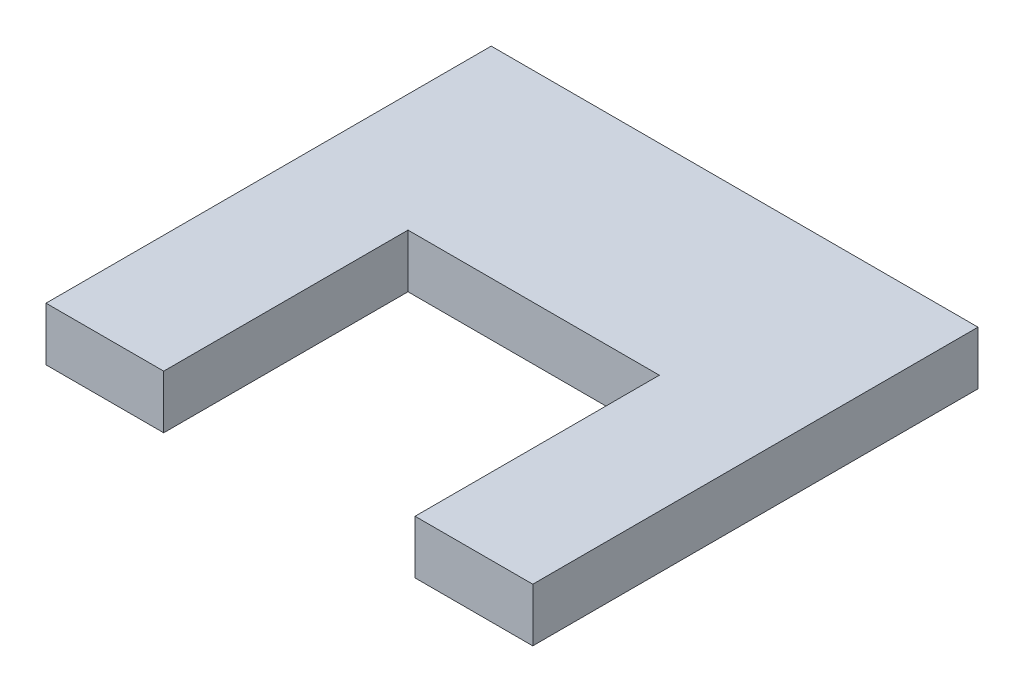
ISO-10303-21;
HEADER;
FILE_DESCRIPTION(('STEP AP214'),'2;1');
FILE_NAME('part.step','',(''),(''),'','','');
FILE_SCHEMA(('AUTOMOTIVE_DESIGN { 1 0 10303 214 1 1 1 1 }'));
ENDSEC;
DATA;
#1=APPLICATION_CONTEXT('core data for automotive mechanical design processes');
#2=APPLICATION_PROTOCOL_DEFINITION('international standard','automotive_design',2000,#1);
#3=PRODUCT_CONTEXT('',#1,'mechanical');
#4=PRODUCT('Part','Part','',(#3));
#5=PRODUCT_RELATED_PRODUCT_CATEGORY('part','',(#4));
#6=PRODUCT_DEFINITION_FORMATION('','',#4);
#7=PRODUCT_DEFINITION_CONTEXT('part definition',#1,'design');
#8=PRODUCT_DEFINITION('design','',#6,#7);
#9=PRODUCT_DEFINITION_SHAPE('','',#8);
#10=(LENGTH_UNIT() NAMED_UNIT(*) SI_UNIT(.MILLI.,.METRE.));
#11=(NAMED_UNIT(*) PLANE_ANGLE_UNIT() SI_UNIT($,.RADIAN.));
#12=(NAMED_UNIT(*) SI_UNIT($,.STERADIAN.) SOLID_ANGLE_UNIT());
#13=UNCERTAINTY_MEASURE_WITH_UNIT(LENGTH_MEASURE(1.E-05),#10,'distance_accuracy_value','');
#14=(GEOMETRIC_REPRESENTATION_CONTEXT(3) GLOBAL_UNCERTAINTY_ASSIGNED_CONTEXT((#13)) GLOBAL_UNIT_ASSIGNED_CONTEXT((#10,
#11,#12)) REPRESENTATION_CONTEXT('',''));
#15=CARTESIAN_POINT('',(0.,0.,0.));
#16=DIRECTION('',(0.,0.,1.));
#17=DIRECTION('',(1.,0.,0.));
#18=AXIS2_PLACEMENT_3D('',#15,#16,#17);
#19=CARTESIAN_POINT('',(-21.17,9.,0.));
#20=DIRECTION('',(1.,0.,0.));
#21=DIRECTION('',(0.,0.,-1.));
#22=AXIS2_PLACEMENT_3D('',#19,#20,#21);
#23=PLANE('',#22);
#24=DIRECTION('',(0.,0.,1.));
#25=VECTOR('',#24,1.);
#26=CARTESIAN_POINT('',(-21.17,0.,0.));
#27=LINE('',#26,#25);
#28=CARTESIAN_POINT('',(-21.17,0.,-3.65000000000001));
#29=VERTEX_POINT('',#28);
#30=CARTESIAN_POINT('',(-21.17,0.,37.5));
#31=VERTEX_POINT('',#30);
#32=EDGE_CURVE('E129',#29,#31,#27,.T.);
#33=ORIENTED_EDGE('',*,*,#32,.F.);
#34=DIRECTION('',(0.,-1.,0.));
#35=VECTOR('',#34,1.);
#36=CARTESIAN_POINT('',(-21.17,9.,-3.65000000000001));
#37=LINE('',#36,#35);
#38=CARTESIAN_POINT('',(-21.17,9.,-3.65000000000001));
#39=VERTEX_POINT('',#38);
#40=EDGE_CURVE('E11',#39,#29,#37,.T.);
#41=ORIENTED_EDGE('',*,*,#40,.F.);
#42=DIRECTION('',(0.,0.,1.));
#43=VECTOR('',#42,1.);
#44=CARTESIAN_POINT('',(-21.17,9.,0.));
#45=LINE('',#44,#43);
#46=CARTESIAN_POINT('',(-21.17,9.,37.5));
#47=VERTEX_POINT('',#46);
#48=EDGE_CURVE('E146',#39,#47,#45,.T.);
#49=ORIENTED_EDGE('',*,*,#48,.T.);
#50=DIRECTION('',(0.,-1.,0.));
#51=VECTOR('',#50,1.);
#52=CARTESIAN_POINT('',(-21.17,9.,37.5));
#53=LINE('',#52,#51);
#54=EDGE_CURVE('E85',#47,#31,#53,.T.);
#55=ORIENTED_EDGE('',*,*,#54,.T.);
#56=EDGE_LOOP('',(#33,#41,#49,#55));
#57=FACE_BOUND('',#56,.T.);
#58=ADVANCED_FACE('F35',(#57),#23,.T.);
#59=CARTESIAN_POINT('',(0.,9.,-3.65000000000001));
#60=DIRECTION('',(0.,0.,-1.));
#61=DIRECTION('',(-1.,0.,0.));
#62=AXIS2_PLACEMENT_3D('',#59,#60,#61);
#63=PLANE('',#62);
#64=DIRECTION('',(1.,0.,0.));
#65=VECTOR('',#64,1.);
#66=CARTESIAN_POINT('',(0.,0.,-3.65000000000001));
#67=LINE('',#66,#65);
#68=CARTESIAN_POINT('',(21.17,0.,-3.65000000000001));
#69=VERTEX_POINT('',#68);
#70=EDGE_CURVE('E132',#29,#69,#67,.T.);
#71=ORIENTED_EDGE('',*,*,#70,.T.);
#72=DIRECTION('',(0.,-1.,0.));
#73=VECTOR('',#72,1.);
#74=CARTESIAN_POINT('',(21.17,9.,-3.65000000000001));
#75=LINE('',#74,#73);
#76=CARTESIAN_POINT('',(21.17,9.,-3.65000000000001));
#77=VERTEX_POINT('',#76);
#78=EDGE_CURVE('E43',#77,#69,#75,.T.);
#79=ORIENTED_EDGE('',*,*,#78,.F.);
#80=DIRECTION('',(1.,0.,0.));
#81=VECTOR('',#80,1.);
#82=CARTESIAN_POINT('',(0.,9.,-3.65000000000001));
#83=LINE('',#82,#81);
#84=EDGE_CURVE('E172',#39,#77,#83,.T.);
#85=ORIENTED_EDGE('',*,*,#84,.F.);
#86=ORIENTED_EDGE('',*,*,#40,.T.);
#87=EDGE_LOOP('',(#71,#79,#85,#86));
#88=FACE_BOUND('',#87,.T.);
#89=ADVANCED_FACE('F176',(#88),#63,.F.);
#90=CARTESIAN_POINT('',(21.17,9.,0.));
#91=DIRECTION('',(1.,0.,0.));
#92=DIRECTION('',(0.,0.,-1.));
#93=AXIS2_PLACEMENT_3D('',#90,#91,#92);
#94=PLANE('',#93);
#95=DIRECTION('',(0.,0.,1.));
#96=VECTOR('',#95,1.);
#97=CARTESIAN_POINT('',(21.17,0.,0.));
#98=LINE('',#97,#96);
#99=CARTESIAN_POINT('',(21.17,0.,37.5));
#100=VERTEX_POINT('',#99);
#101=EDGE_CURVE('E134',#69,#100,#98,.T.);
#102=ORIENTED_EDGE('',*,*,#101,.T.);
#103=DIRECTION('',(0.,-1.,0.));
#104=VECTOR('',#103,1.);
#105=CARTESIAN_POINT('',(21.17,9.,37.5));
#106=LINE('',#105,#104);
#107=CARTESIAN_POINT('',(21.17,9.,37.5));
#108=VERTEX_POINT('',#107);
#109=EDGE_CURVE('E152',#108,#100,#106,.T.);
#110=ORIENTED_EDGE('',*,*,#109,.F.);
#111=DIRECTION('',(0.,0.,1.));
#112=VECTOR('',#111,1.);
#113=CARTESIAN_POINT('',(21.17,9.,0.));
#114=LINE('',#113,#112);
#115=EDGE_CURVE('E161',#77,#108,#114,.T.);
#116=ORIENTED_EDGE('',*,*,#115,.F.);
#117=ORIENTED_EDGE('',*,*,#78,.T.);
#118=EDGE_LOOP('',(#102,#110,#116,#117));
#119=FACE_BOUND('',#118,.T.);
#120=ADVANCED_FACE('F159',(#119),#94,.F.);
#121=CARTESIAN_POINT('',(0.,9.,37.5));
#122=DIRECTION('',(0.,0.,-1.));
#123=DIRECTION('',(-1.,0.,0.));
#124=AXIS2_PLACEMENT_3D('',#121,#122,#123);
#125=PLANE('',#124);
#126=DIRECTION('',(1.,0.,0.));
#127=VECTOR('',#126,1.);
#128=CARTESIAN_POINT('',(0.,0.,37.5));
#129=LINE('',#128,#127);
#130=CARTESIAN_POINT('',(41.,0.,37.5));
#131=VERTEX_POINT('',#130);
#132=EDGE_CURVE('E136',#100,#131,#129,.T.);
#133=ORIENTED_EDGE('',*,*,#132,.T.);
#134=DIRECTION('',(0.,-1.,0.));
#135=VECTOR('',#134,1.);
#136=CARTESIAN_POINT('',(41.,9.,37.5));
#137=LINE('',#136,#135);
#138=CARTESIAN_POINT('',(41.,9.,37.5));
#139=VERTEX_POINT('',#138);
#140=EDGE_CURVE('E150',#139,#131,#137,.T.);
#141=ORIENTED_EDGE('',*,*,#140,.F.);
#142=DIRECTION('',(1.,0.,0.));
#143=VECTOR('',#142,1.);
#144=CARTESIAN_POINT('',(0.,9.,37.5));
#145=LINE('',#144,#143);
#146=EDGE_CURVE('E124',#108,#139,#145,.T.);
#147=ORIENTED_EDGE('',*,*,#146,.F.);
#148=ORIENTED_EDGE('',*,*,#109,.T.);
#149=EDGE_LOOP('',(#133,#141,#147,#148));
#150=FACE_BOUND('',#149,.T.);
#151=ADVANCED_FACE('F170',(#150),#125,.F.);
#152=CARTESIAN_POINT('',(41.,9.,0.));
#153=DIRECTION('',(1.,0.,0.));
#154=DIRECTION('',(0.,0.,-1.));
#155=AXIS2_PLACEMENT_3D('',#152,#153,#154);
#156=PLANE('',#155);
#157=DIRECTION('',(0.,0.,1.));
#158=VECTOR('',#157,1.);
#159=CARTESIAN_POINT('',(41.,0.,0.));
#160=LINE('',#159,#158);
#161=CARTESIAN_POINT('',(41.,0.,-37.5));
#162=VERTEX_POINT('',#161);
#163=EDGE_CURVE('E139',#162,#131,#160,.T.);
#164=ORIENTED_EDGE('',*,*,#163,.F.);
#165=DIRECTION('',(0.,-1.,0.));
#166=VECTOR('',#165,1.);
#167=CARTESIAN_POINT('',(41.,9.,-37.5));
#168=LINE('',#167,#166);
#169=CARTESIAN_POINT('',(41.,9.,-37.5));
#170=VERTEX_POINT('',#169);
#171=EDGE_CURVE('E113',#170,#162,#168,.T.);
#172=ORIENTED_EDGE('',*,*,#171,.F.);
#173=DIRECTION('',(0.,0.,1.));
#174=VECTOR('',#173,1.);
#175=CARTESIAN_POINT('',(41.,9.,0.));
#176=LINE('',#175,#174);
#177=EDGE_CURVE('E122',#170,#139,#176,.T.);
#178=ORIENTED_EDGE('',*,*,#177,.T.);
#179=ORIENTED_EDGE('',*,*,#140,.T.);
#180=EDGE_LOOP('',(#164,#172,#178,#179));
#181=FACE_BOUND('',#180,.T.);
#182=ADVANCED_FACE('F186',(#181),#156,.T.);
#183=CARTESIAN_POINT('',(0.,9.,-37.5));
#184=DIRECTION('',(0.,0.,-1.));
#185=DIRECTION('',(-1.,0.,0.));
#186=AXIS2_PLACEMENT_3D('',#183,#184,#185);
#187=PLANE('',#186);
#188=DIRECTION('',(1.,0.,0.));
#189=VECTOR('',#188,1.);
#190=CARTESIAN_POINT('',(0.,0.,-37.5));
#191=LINE('',#190,#189);
#192=CARTESIAN_POINT('',(-41.,0.,-37.5));
#193=VERTEX_POINT('',#192);
#194=EDGE_CURVE('E112',#193,#162,#191,.T.);
#195=ORIENTED_EDGE('',*,*,#194,.F.);
#196=DIRECTION('',(0.,-1.,0.));
#197=VECTOR('',#196,1.);
#198=CARTESIAN_POINT('',(-41.,9.,-37.5));
#199=LINE('',#198,#197);
#200=CARTESIAN_POINT('',(-41.,9.,-37.5));
#201=VERTEX_POINT('',#200);
#202=EDGE_CURVE('E106',#201,#193,#199,.T.);
#203=ORIENTED_EDGE('',*,*,#202,.F.);
#204=DIRECTION('',(1.,0.,0.));
#205=VECTOR('',#204,1.);
#206=CARTESIAN_POINT('',(0.,9.,-37.5));
#207=LINE('',#206,#205);
#208=EDGE_CURVE('E110',#201,#170,#207,.T.);
#209=ORIENTED_EDGE('',*,*,#208,.T.);
#210=ORIENTED_EDGE('',*,*,#171,.T.);
#211=EDGE_LOOP('',(#195,#203,#209,#210));
#212=FACE_BOUND('',#211,.T.);
#213=ADVANCED_FACE('F108',(#212),#187,.T.);
#214=CARTESIAN_POINT('',(-41.,9.,0.));
#215=DIRECTION('',(1.,0.,0.));
#216=DIRECTION('',(0.,0.,-1.));
#217=AXIS2_PLACEMENT_3D('',#214,#215,#216);
#218=PLANE('',#217);
#219=DIRECTION('',(0.,0.,1.));
#220=VECTOR('',#219,1.);
#221=CARTESIAN_POINT('',(-41.,0.,0.));
#222=LINE('',#221,#220);
#223=CARTESIAN_POINT('',(-41.,0.,37.5));
#224=VERTEX_POINT('',#223);
#225=EDGE_CURVE('E78',#193,#224,#222,.T.);
#226=ORIENTED_EDGE('',*,*,#225,.T.);
#227=DIRECTION('',(0.,-1.,0.));
#228=VECTOR('',#227,1.);
#229=CARTESIAN_POINT('',(-41.,9.,37.5));
#230=LINE('',#229,#228);
#231=CARTESIAN_POINT('',(-41.,9.,37.5));
#232=VERTEX_POINT('',#231);
#233=EDGE_CURVE('E114',#232,#224,#230,.T.);
#234=ORIENTED_EDGE('',*,*,#233,.F.);
#235=DIRECTION('',(0.,0.,1.));
#236=VECTOR('',#235,1.);
#237=CARTESIAN_POINT('',(-41.,9.,0.));
#238=LINE('',#237,#236);
#239=EDGE_CURVE('E116',#201,#232,#238,.T.);
#240=ORIENTED_EDGE('',*,*,#239,.F.);
#241=ORIENTED_EDGE('',*,*,#202,.T.);
#242=EDGE_LOOP('',(#226,#234,#240,#241));
#243=FACE_BOUND('',#242,.T.);
#244=ADVANCED_FACE('F117',(#243),#218,.F.);
#245=CARTESIAN_POINT('',(0.,9.,37.5));
#246=DIRECTION('',(0.,0.,-1.));
#247=DIRECTION('',(-1.,0.,0.));
#248=AXIS2_PLACEMENT_3D('',#245,#246,#247);
#249=PLANE('',#248);
#250=DIRECTION('',(1.,0.,0.));
#251=VECTOR('',#250,1.);
#252=CARTESIAN_POINT('',(0.,0.,37.5));
#253=LINE('',#252,#251);
#254=EDGE_CURVE('E144',#224,#31,#253,.T.);
#255=ORIENTED_EDGE('',*,*,#254,.T.);
#256=ORIENTED_EDGE('',*,*,#54,.F.);
#257=DIRECTION('',(1.,0.,0.));
#258=VECTOR('',#257,1.);
#259=CARTESIAN_POINT('',(0.,9.,37.5));
#260=LINE('',#259,#258);
#261=EDGE_CURVE('E51',#232,#47,#260,.T.);
#262=ORIENTED_EDGE('',*,*,#261,.F.);
#263=ORIENTED_EDGE('',*,*,#233,.T.);
#264=EDGE_LOOP('',(#255,#256,#262,#263));
#265=FACE_BOUND('',#264,.T.);
#266=ADVANCED_FACE('F194',(#265),#249,.F.);
#267=CARTESIAN_POINT('',(0.,9.,0.));
#268=DIRECTION('',(0.,1.,0.));
#269=DIRECTION('',(0.,0.,1.));
#270=AXIS2_PLACEMENT_3D('',#267,#268,#269);
#271=PLANE('',#270);
#272=ORIENTED_EDGE('',*,*,#48,.F.);
#273=ORIENTED_EDGE('',*,*,#84,.T.);
#274=ORIENTED_EDGE('',*,*,#115,.T.);
#275=ORIENTED_EDGE('',*,*,#146,.T.);
#276=ORIENTED_EDGE('',*,*,#177,.F.);
#277=ORIENTED_EDGE('',*,*,#208,.F.);
#278=ORIENTED_EDGE('',*,*,#239,.T.);
#279=ORIENTED_EDGE('',*,*,#261,.T.);
#280=EDGE_LOOP('',(#272,#273,#274,#275,#276,#277,#278,#279));
#281=FACE_BOUND('',#280,.T.);
#282=ADVANCED_FACE('F120',(#281),#271,.T.);
#283=CARTESIAN_POINT('',(0.,0.,0.));
#284=DIRECTION('',(0.,1.,0.));
#285=DIRECTION('',(0.,0.,1.));
#286=AXIS2_PLACEMENT_3D('',#283,#284,#285);
#287=PLANE('',#286);
#288=ORIENTED_EDGE('',*,*,#32,.T.);
#289=ORIENTED_EDGE('',*,*,#254,.F.);
#290=ORIENTED_EDGE('',*,*,#225,.F.);
#291=ORIENTED_EDGE('',*,*,#194,.T.);
#292=ORIENTED_EDGE('',*,*,#163,.T.);
#293=ORIENTED_EDGE('',*,*,#132,.F.);
#294=ORIENTED_EDGE('',*,*,#101,.F.);
#295=ORIENTED_EDGE('',*,*,#70,.F.);
#296=EDGE_LOOP('',(#288,#289,#290,#291,#292,#293,#294,#295));
#297=FACE_BOUND('',#296,.T.);
#298=ADVANCED_FACE('F166',(#297),#287,.F.);
#299=CLOSED_SHELL('',(#58,#89,#120,#151,#182,#213,#244,#266,#282,#298));
#300=MANIFOLD_SOLID_BREP('B2',#299);
#301=ADVANCED_BREP_SHAPE_REPRESENTATION('',(#18,#300),#14);
#302=SHAPE_DEFINITION_REPRESENTATION(#9,#301);
ENDSEC;
END-ISO-10303-21;
